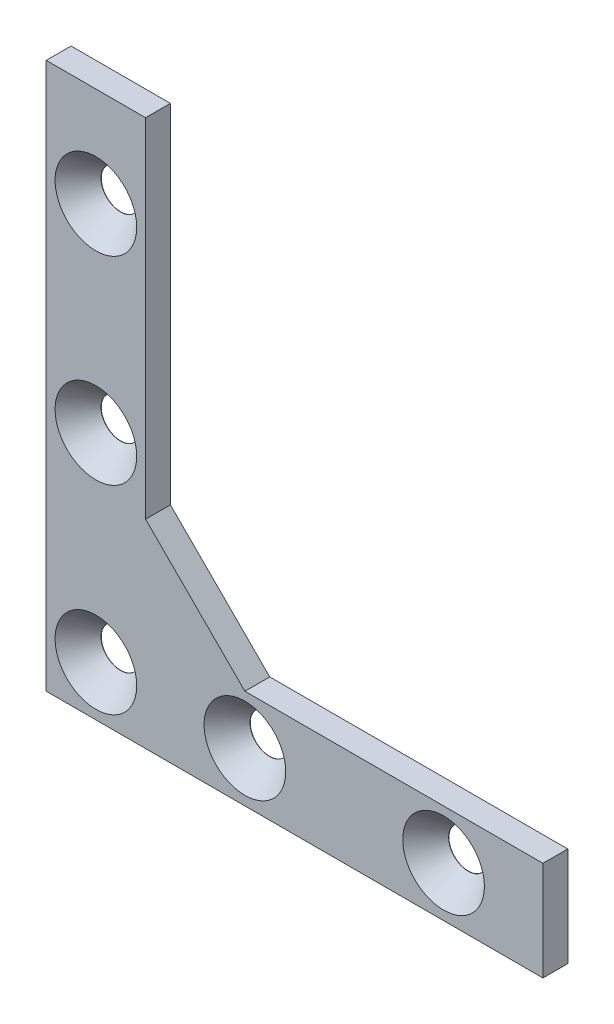
ISO-10303-21;
HEADER;
FILE_DESCRIPTION(('STEP AP214'),'2;1');
FILE_NAME('part.step','',(''),(''),'','','');
FILE_SCHEMA(('AUTOMOTIVE_DESIGN { 1 0 10303 214 1 1 1 1 }'));
ENDSEC;
DATA;
#1=APPLICATION_CONTEXT('core data for automotive mechanical design processes');
#2=APPLICATION_PROTOCOL_DEFINITION('international standard','automotive_design',2000,#1);
#3=PRODUCT_CONTEXT('',#1,'mechanical');
#4=PRODUCT('Part','Part','',(#3));
#5=PRODUCT_RELATED_PRODUCT_CATEGORY('part','',(#4));
#6=PRODUCT_DEFINITION_FORMATION('','',#4);
#7=PRODUCT_DEFINITION_CONTEXT('part definition',#1,'design');
#8=PRODUCT_DEFINITION('design','',#6,#7);
#9=PRODUCT_DEFINITION_SHAPE('','',#8);
#10=(LENGTH_UNIT() NAMED_UNIT(*) SI_UNIT(.MILLI.,.METRE.));
#11=(NAMED_UNIT(*) PLANE_ANGLE_UNIT() SI_UNIT($,.RADIAN.));
#12=(NAMED_UNIT(*) SI_UNIT($,.STERADIAN.) SOLID_ANGLE_UNIT());
#13=UNCERTAINTY_MEASURE_WITH_UNIT(LENGTH_MEASURE(1.E-05),#10,'distance_accuracy_value','');
#14=(GEOMETRIC_REPRESENTATION_CONTEXT(3) GLOBAL_UNCERTAINTY_ASSIGNED_CONTEXT((#13)) GLOBAL_UNIT_ASSIGNED_CONTEXT((#10,
#11,#12)) REPRESENTATION_CONTEXT('',''));
#15=CARTESIAN_POINT('',(0.,0.,0.));
#16=DIRECTION('',(0.,0.,1.));
#17=DIRECTION('',(1.,0.,0.));
#18=AXIS2_PLACEMENT_3D('',#15,#16,#17);
#19=CARTESIAN_POINT('',(-273.453367516007,-6.34999999999997,3.175));
#20=DIRECTION('',(0.,1.,0.));
#21=DIRECTION('',(0.,0.,1.));
#22=AXIS2_PLACEMENT_3D('',#19,#20,#21);
#23=PLANE('',#22);
#24=DIRECTION('',(1.,0.,0.));
#25=VECTOR('',#24,1.);
#26=CARTESIAN_POINT('',(-273.453367516007,-6.34999999999997,0.));
#27=LINE('',#26,#25);
#28=CARTESIAN_POINT('',(-273.453367516007,-6.34999999999997,0.));
#29=VERTEX_POINT('',#28);
#30=CARTESIAN_POINT('',(-209.953367516007,-6.34999999999997,0.));
#31=VERTEX_POINT('',#30);
#32=EDGE_CURVE('E127',#29,#31,#27,.T.);
#33=ORIENTED_EDGE('',*,*,#32,.T.);
#34=DIRECTION('',(0.,0.,-1.));
#35=VECTOR('',#34,1.);
#36=CARTESIAN_POINT('',(-209.953367516007,-6.34999999999997,3.175));
#37=LINE('',#36,#35);
#38=CARTESIAN_POINT('',(-209.953367516007,-6.34999999999997,3.175));
#39=VERTEX_POINT('',#38);
#40=EDGE_CURVE('E11',#39,#31,#37,.T.);
#41=ORIENTED_EDGE('',*,*,#40,.F.);
#42=DIRECTION('',(1.,0.,0.));
#43=VECTOR('',#42,1.);
#44=CARTESIAN_POINT('',(-273.453367516007,-6.34999999999997,3.175));
#45=LINE('',#44,#43);
#46=CARTESIAN_POINT('',(-273.453367516007,-6.34999999999997,3.175));
#47=VERTEX_POINT('',#46);
#48=EDGE_CURVE('E140',#47,#39,#45,.T.);
#49=ORIENTED_EDGE('',*,*,#48,.F.);
#50=DIRECTION('',(0.,0.,-1.));
#51=VECTOR('',#50,1.);
#52=CARTESIAN_POINT('',(-273.453367516007,-6.34999999999997,3.175));
#53=LINE('',#52,#51);
#54=EDGE_CURVE('E123',#47,#29,#53,.T.);
#55=ORIENTED_EDGE('',*,*,#54,.T.);
#56=EDGE_LOOP('',(#33,#41,#49,#55));
#57=FACE_BOUND('',#56,.T.);
#58=ADVANCED_FACE('F37',(#57),#23,.F.);
#59=CARTESIAN_POINT('',(-209.953367516007,-6.34999999999997,3.175));
#60=DIRECTION('',(-1.,0.,0.));
#61=DIRECTION('',(0.,0.,1.));
#62=AXIS2_PLACEMENT_3D('',#59,#60,#61);
#63=PLANE('',#62);
#64=DIRECTION('',(0.,1.,0.));
#65=VECTOR('',#64,1.);
#66=CARTESIAN_POINT('',(-209.953367516007,-6.34999999999997,0.));
#67=LINE('',#66,#65);
#68=CARTESIAN_POINT('',(-209.953367516007,6.3500000000002,0.));
#69=VERTEX_POINT('',#68);
#70=EDGE_CURVE('E130',#31,#69,#67,.T.);
#71=ORIENTED_EDGE('',*,*,#70,.T.);
#72=DIRECTION('',(0.,0.,-1.));
#73=VECTOR('',#72,1.);
#74=CARTESIAN_POINT('',(-209.953367516007,6.3500000000002,3.175));
#75=LINE('',#74,#73);
#76=CARTESIAN_POINT('',(-209.953367516007,6.3500000000002,3.175));
#77=VERTEX_POINT('',#76);
#78=EDGE_CURVE('E45',#77,#69,#75,.T.);
#79=ORIENTED_EDGE('',*,*,#78,.F.);
#80=DIRECTION('',(0.,1.,0.));
#81=VECTOR('',#80,1.);
#82=CARTESIAN_POINT('',(-209.953367516007,-6.34999999999997,3.175));
#83=LINE('',#82,#81);
#84=EDGE_CURVE('E93',#39,#77,#83,.T.);
#85=ORIENTED_EDGE('',*,*,#84,.F.);
#86=ORIENTED_EDGE('',*,*,#40,.T.);
#87=EDGE_LOOP('',(#71,#79,#85,#86));
#88=FACE_BOUND('',#87,.T.);
#89=ADVANCED_FACE('F239',(#88),#63,.F.);
#90=CARTESIAN_POINT('',(-209.953367516007,6.3500000000002,3.175));
#91=DIRECTION('',(0.,-1.,0.));
#92=DIRECTION('',(1.,0.,0.));
#93=AXIS2_PLACEMENT_3D('',#90,#91,#92);
#94=PLANE('',#93);
#95=DIRECTION('',(-1.,0.,0.));
#96=VECTOR('',#95,1.);
#97=CARTESIAN_POINT('',(-209.953367516007,6.3500000000002,0.));
#98=LINE('',#97,#96);
#99=CARTESIAN_POINT('',(-248.053367516008,6.35000000000003,0.));
#100=VERTEX_POINT('',#99);
#101=EDGE_CURVE('E133',#69,#100,#98,.T.);
#102=ORIENTED_EDGE('',*,*,#101,.T.);
#103=DIRECTION('',(0.,0.,-1.));
#104=VECTOR('',#103,1.);
#105=CARTESIAN_POINT('',(-248.053367516008,6.35000000000003,3.175));
#106=LINE('',#105,#104);
#107=CARTESIAN_POINT('',(-248.053367516008,6.35000000000003,3.175));
#108=VERTEX_POINT('',#107);
#109=EDGE_CURVE('E144',#108,#100,#106,.T.);
#110=ORIENTED_EDGE('',*,*,#109,.F.);
#111=DIRECTION('',(-1.,0.,0.));
#112=VECTOR('',#111,1.);
#113=CARTESIAN_POINT('',(-209.953367516007,6.3500000000002,3.175));
#114=LINE('',#113,#112);
#115=EDGE_CURVE('E152',#77,#108,#114,.T.);
#116=ORIENTED_EDGE('',*,*,#115,.F.);
#117=ORIENTED_EDGE('',*,*,#78,.T.);
#118=EDGE_LOOP('',(#102,#110,#116,#117));
#119=FACE_BOUND('',#118,.T.);
#120=ADVANCED_FACE('F150',(#119),#94,.F.);
#121=CARTESIAN_POINT('',(-248.053367516008,6.35000000000003,3.175));
#122=DIRECTION('',(-0.707106781186556,-0.707106781186539,0.));
#123=DIRECTION('',(0.707106781186539,-0.707106781186556,0.));
#124=AXIS2_PLACEMENT_3D('',#121,#122,#123);
#125=PLANE('',#124);
#126=DIRECTION('',(-0.707106781186539,0.707106781186556,0.));
#127=VECTOR('',#126,1.);
#128=CARTESIAN_POINT('',(-248.053367516008,6.35000000000003,0.));
#129=LINE('',#128,#127);
#130=CARTESIAN_POINT('',(-260.753367516007,19.05,0.));
#131=VERTEX_POINT('',#130);
#132=EDGE_CURVE('E135',#100,#131,#129,.T.);
#133=ORIENTED_EDGE('',*,*,#132,.T.);
#134=DIRECTION('',(0.,0.,-1.));
#135=VECTOR('',#134,1.);
#136=CARTESIAN_POINT('',(-260.753367516007,19.05,3.175));
#137=LINE('',#136,#135);
#138=CARTESIAN_POINT('',(-260.753367516007,19.05,3.175));
#139=VERTEX_POINT('',#138);
#140=EDGE_CURVE('E118',#139,#131,#137,.T.);
#141=ORIENTED_EDGE('',*,*,#140,.F.);
#142=DIRECTION('',(-0.707106781186539,0.707106781186556,0.));
#143=VECTOR('',#142,1.);
#144=CARTESIAN_POINT('',(-248.053367516008,6.35000000000003,3.175));
#145=LINE('',#144,#143);
#146=EDGE_CURVE('E109',#108,#139,#145,.T.);
#147=ORIENTED_EDGE('',*,*,#146,.F.);
#148=ORIENTED_EDGE('',*,*,#109,.T.);
#149=EDGE_LOOP('',(#133,#141,#147,#148));
#150=FACE_BOUND('',#149,.T.);
#151=ADVANCED_FACE('F158',(#150),#125,.F.);
#152=CARTESIAN_POINT('',(-260.753367516007,19.05,3.175));
#153=DIRECTION('',(-1.,0.,0.));
#154=DIRECTION('',(0.,0.,1.));
#155=AXIS2_PLACEMENT_3D('',#152,#153,#154);
#156=PLANE('',#155);
#157=DIRECTION('',(0.,1.,0.));
#158=VECTOR('',#157,1.);
#159=CARTESIAN_POINT('',(-260.753367516007,19.05,0.));
#160=LINE('',#159,#158);
#161=CARTESIAN_POINT('',(-260.753367516007,63.5,0.));
#162=VERTEX_POINT('',#161);
#163=EDGE_CURVE('E117',#131,#162,#160,.T.);
#164=ORIENTED_EDGE('',*,*,#163,.T.);
#165=DIRECTION('',(0.,0.,-1.));
#166=VECTOR('',#165,1.);
#167=CARTESIAN_POINT('',(-260.753367516007,63.5,3.175));
#168=LINE('',#167,#166);
#169=CARTESIAN_POINT('',(-260.753367516007,63.5,3.175));
#170=VERTEX_POINT('',#169);
#171=EDGE_CURVE('E114',#170,#162,#168,.T.);
#172=ORIENTED_EDGE('',*,*,#171,.F.);
#173=DIRECTION('',(0.,1.,0.));
#174=VECTOR('',#173,1.);
#175=CARTESIAN_POINT('',(-260.753367516007,19.05,3.175));
#176=LINE('',#175,#174);
#177=EDGE_CURVE('E103',#139,#170,#176,.T.);
#178=ORIENTED_EDGE('',*,*,#177,.F.);
#179=ORIENTED_EDGE('',*,*,#140,.T.);
#180=EDGE_LOOP('',(#164,#172,#178,#179));
#181=FACE_BOUND('',#180,.T.);
#182=ADVANCED_FACE('F115',(#181),#156,.F.);
#183=CARTESIAN_POINT('',(-273.453367516007,63.5,3.175));
#184=DIRECTION('',(0.,-1.,0.));
#185=DIRECTION('',(0.,0.,-1.));
#186=AXIS2_PLACEMENT_3D('',#183,#184,#185);
#187=PLANE('',#186);
#188=DIRECTION('',(-1.,0.,0.));
#189=VECTOR('',#188,1.);
#190=CARTESIAN_POINT('',(-273.453367516007,63.5,0.));
#191=LINE('',#190,#189);
#192=CARTESIAN_POINT('',(-273.453367516007,63.5,0.));
#193=VERTEX_POINT('',#192);
#194=EDGE_CURVE('E79',#162,#193,#191,.T.);
#195=ORIENTED_EDGE('',*,*,#194,.T.);
#196=DIRECTION('',(0.,0.,-1.));
#197=VECTOR('',#196,1.);
#198=CARTESIAN_POINT('',(-273.453367516007,63.5,3.175));
#199=LINE('',#198,#197);
#200=CARTESIAN_POINT('',(-273.453367516007,63.5,3.175));
#201=VERTEX_POINT('',#200);
#202=EDGE_CURVE('E119',#201,#193,#199,.T.);
#203=ORIENTED_EDGE('',*,*,#202,.F.);
#204=DIRECTION('',(-1.,0.,0.));
#205=VECTOR('',#204,1.);
#206=CARTESIAN_POINT('',(-273.453367516007,63.5,3.175));
#207=LINE('',#206,#205);
#208=EDGE_CURVE('E107',#170,#201,#207,.T.);
#209=ORIENTED_EDGE('',*,*,#208,.F.);
#210=ORIENTED_EDGE('',*,*,#171,.T.);
#211=EDGE_LOOP('',(#195,#203,#209,#210));
#212=FACE_BOUND('',#211,.T.);
#213=ADVANCED_FACE('F121',(#212),#187,.F.);
#214=CARTESIAN_POINT('',(-273.453367516007,-6.34999999999997,3.175));
#215=DIRECTION('',(1.,0.,0.));
#216=DIRECTION('',(0.,0.,-1.));
#217=AXIS2_PLACEMENT_3D('',#214,#215,#216);
#218=PLANE('',#217);
#219=DIRECTION('',(0.,-1.,0.));
#220=VECTOR('',#219,1.);
#221=CARTESIAN_POINT('',(-273.453367516007,-6.34999999999997,0.));
#222=LINE('',#221,#220);
#223=EDGE_CURVE('E85',#193,#29,#222,.T.);
#224=ORIENTED_EDGE('',*,*,#223,.T.);
#225=ORIENTED_EDGE('',*,*,#54,.F.);
#226=DIRECTION('',(0.,-1.,0.));
#227=VECTOR('',#226,1.);
#228=CARTESIAN_POINT('',(-273.453367516007,-6.34999999999997,3.175));
#229=LINE('',#228,#227);
#230=EDGE_CURVE('E53',#201,#47,#229,.T.);
#231=ORIENTED_EDGE('',*,*,#230,.F.);
#232=ORIENTED_EDGE('',*,*,#202,.T.);
#233=EDGE_LOOP('',(#224,#225,#231,#232));
#234=FACE_BOUND('',#233,.T.);
#235=ADVANCED_FACE('F212',(#234),#218,.F.);
#236=CARTESIAN_POINT('',(0.,0.,3.175));
#237=DIRECTION('',(0.,0.,1.));
#238=DIRECTION('',(1.,0.,0.));
#239=AXIS2_PLACEMENT_3D('',#236,#237,#238);
#240=PLANE('',#239);
#241=CARTESIAN_POINT('',(-267.103367516007,0.038229414694689,3.175));
#242=DIRECTION('',(0.,0.,1.));
#243=DIRECTION('',(1.,0.,0.));
#244=AXIS2_PLACEMENT_3D('',#241,#242,#243);
#245=CIRCLE('',#244,5.21969999999999);
#246=CARTESIAN_POINT('',(-261.883667516008,0.038229414694689,3.175));
#247=VERTEX_POINT('',#246);
#248=EDGE_CURVE('E204',#247,#247,#245,.T.);
#249=ORIENTED_EDGE('',*,*,#248,.F.);
#250=EDGE_LOOP('',(#249));
#251=FACE_BOUND('',#250,.T.);
#252=CARTESIAN_POINT('',(-267.103367516007,25.4382294146947,3.175));
#253=DIRECTION('',(0.,0.,1.));
#254=DIRECTION('',(1.,0.,0.));
#255=AXIS2_PLACEMENT_3D('',#252,#253,#254);
#256=CIRCLE('',#255,5.21969999999999);
#257=CARTESIAN_POINT('',(-261.883667516008,25.4382294146947,3.175));
#258=VERTEX_POINT('',#257);
#259=EDGE_CURVE('E195',#258,#258,#256,.T.);
#260=ORIENTED_EDGE('',*,*,#259,.F.);
#261=EDGE_LOOP('',(#260));
#262=FACE_BOUND('',#261,.T.);
#263=CARTESIAN_POINT('',(-267.103367516007,50.8,3.175));
#264=DIRECTION('',(0.,0.,1.));
#265=DIRECTION('',(1.,0.,0.));
#266=AXIS2_PLACEMENT_3D('',#263,#264,#265);
#267=CIRCLE('',#266,5.21969999999999);
#268=CARTESIAN_POINT('',(-261.883667516008,50.8,3.175));
#269=VERTEX_POINT('',#268);
#270=EDGE_CURVE('E186',#269,#269,#267,.T.);
#271=ORIENTED_EDGE('',*,*,#270,.F.);
#272=EDGE_LOOP('',(#271));
#273=FACE_BOUND('',#272,.T.);
#274=CARTESIAN_POINT('',(-248.053367516007,0.038229414694689,3.175));
#275=DIRECTION('',(0.,0.,1.));
#276=DIRECTION('',(1.,0.,0.));
#277=AXIS2_PLACEMENT_3D('',#274,#275,#276);
#278=CIRCLE('',#277,5.21969999999999);
#279=CARTESIAN_POINT('',(-242.833667516007,0.038229414694689,3.175));
#280=VERTEX_POINT('',#279);
#281=EDGE_CURVE('E177',#280,#280,#278,.T.);
#282=ORIENTED_EDGE('',*,*,#281,.F.);
#283=EDGE_LOOP('',(#282));
#284=FACE_BOUND('',#283,.T.);
#285=CARTESIAN_POINT('',(-222.653367516007,0.038229414694689,3.175));
#286=DIRECTION('',(0.,0.,1.));
#287=DIRECTION('',(1.,0.,0.));
#288=AXIS2_PLACEMENT_3D('',#285,#286,#287);
#289=CIRCLE('',#288,5.21969999999999);
#290=CARTESIAN_POINT('',(-217.433667516007,0.038229414694689,3.175));
#291=VERTEX_POINT('',#290);
#292=EDGE_CURVE('E168',#291,#291,#289,.T.);
#293=ORIENTED_EDGE('',*,*,#292,.F.);
#294=EDGE_LOOP('',(#293));
#295=FACE_BOUND('',#294,.T.);
#296=ORIENTED_EDGE('',*,*,#48,.T.);
#297=ORIENTED_EDGE('',*,*,#84,.T.);
#298=ORIENTED_EDGE('',*,*,#115,.T.);
#299=ORIENTED_EDGE('',*,*,#146,.T.);
#300=ORIENTED_EDGE('',*,*,#177,.T.);
#301=ORIENTED_EDGE('',*,*,#208,.T.);
#302=ORIENTED_EDGE('',*,*,#230,.T.);
#303=EDGE_LOOP('',(#296,#297,#298,#299,#300,#301,#302));
#304=FACE_BOUND('',#303,.T.);
#305=ADVANCED_FACE('F105',(#251,#262,#273,#284,#295,#304),#240,.T.);
#306=CARTESIAN_POINT('',(0.,0.,0.));
#307=DIRECTION('',(0.,0.,1.));
#308=DIRECTION('',(1.,0.,0.));
#309=AXIS2_PLACEMENT_3D('',#306,#307,#308);
#310=PLANE('',#309);
#311=CARTESIAN_POINT('',(-267.103367516007,0.038229414694689,0.));
#312=DIRECTION('',(0.,0.,1.));
#313=DIRECTION('',(1.,0.,0.));
#314=AXIS2_PLACEMENT_3D('',#311,#312,#313);
#315=CIRCLE('',#314,2.48920000000002);
#316=CARTESIAN_POINT('',(-264.614167516007,0.038229414694689,0.));
#317=VERTEX_POINT('',#316);
#318=EDGE_CURVE('E198',#317,#317,#315,.T.);
#319=ORIENTED_EDGE('',*,*,#318,.T.);
#320=EDGE_LOOP('',(#319));
#321=FACE_BOUND('',#320,.T.);
#322=CARTESIAN_POINT('',(-267.103367516007,25.4382294146947,0.));
#323=DIRECTION('',(0.,0.,1.));
#324=DIRECTION('',(1.,0.,0.));
#325=AXIS2_PLACEMENT_3D('',#322,#323,#324);
#326=CIRCLE('',#325,2.48920000000002);
#327=CARTESIAN_POINT('',(-264.614167516007,25.4382294146947,0.));
#328=VERTEX_POINT('',#327);
#329=EDGE_CURVE('E189',#328,#328,#326,.T.);
#330=ORIENTED_EDGE('',*,*,#329,.T.);
#331=EDGE_LOOP('',(#330));
#332=FACE_BOUND('',#331,.T.);
#333=CARTESIAN_POINT('',(-267.103367516007,50.8,0.));
#334=DIRECTION('',(0.,0.,1.));
#335=DIRECTION('',(1.,0.,0.));
#336=AXIS2_PLACEMENT_3D('',#333,#334,#335);
#337=CIRCLE('',#336,2.48920000000002);
#338=CARTESIAN_POINT('',(-264.614167516007,50.8,0.));
#339=VERTEX_POINT('',#338);
#340=EDGE_CURVE('E180',#339,#339,#337,.T.);
#341=ORIENTED_EDGE('',*,*,#340,.T.);
#342=EDGE_LOOP('',(#341));
#343=FACE_BOUND('',#342,.T.);
#344=CARTESIAN_POINT('',(-248.053367516007,0.038229414694689,0.));
#345=DIRECTION('',(0.,0.,1.));
#346=DIRECTION('',(1.,0.,0.));
#347=AXIS2_PLACEMENT_3D('',#344,#345,#346);
#348=CIRCLE('',#347,2.4892);
#349=CARTESIAN_POINT('',(-245.564167516007,0.038229414694689,0.));
#350=VERTEX_POINT('',#349);
#351=EDGE_CURVE('E171',#350,#350,#348,.T.);
#352=ORIENTED_EDGE('',*,*,#351,.T.);
#353=EDGE_LOOP('',(#352));
#354=FACE_BOUND('',#353,.T.);
#355=CARTESIAN_POINT('',(-222.653367516007,0.038229414694689,0.));
#356=DIRECTION('',(0.,0.,1.));
#357=DIRECTION('',(1.,0.,0.));
#358=AXIS2_PLACEMENT_3D('',#355,#356,#357);
#359=CIRCLE('',#358,2.4892);
#360=CARTESIAN_POINT('',(-220.164167516007,0.038229414694689,0.));
#361=VERTEX_POINT('',#360);
#362=EDGE_CURVE('E131',#361,#361,#359,.T.);
#363=ORIENTED_EDGE('',*,*,#362,.T.);
#364=EDGE_LOOP('',(#363));
#365=FACE_BOUND('',#364,.T.);
#366=ORIENTED_EDGE('',*,*,#32,.F.);
#367=ORIENTED_EDGE('',*,*,#223,.F.);
#368=ORIENTED_EDGE('',*,*,#194,.F.);
#369=ORIENTED_EDGE('',*,*,#163,.F.);
#370=ORIENTED_EDGE('',*,*,#132,.F.);
#371=ORIENTED_EDGE('',*,*,#101,.F.);
#372=ORIENTED_EDGE('',*,*,#70,.F.);
#373=EDGE_LOOP('',(#366,#367,#368,#369,#370,#371,#372));
#374=FACE_BOUND('',#373,.T.);
#375=ADVANCED_FACE('F156',(#321,#332,#343,#354,#365,#374),#310,.F.);
#376=CARTESIAN_POINT('',(-222.653367516007,0.038229414694689,3.175));
#377=DIRECTION('',(0.,0.,1.));
#378=DIRECTION('',(1.,0.,0.));
#379=AXIS2_PLACEMENT_3D('',#376,#377,#378);
#380=CYLINDRICAL_SURFACE('',#379,2.4892);
#381=ORIENTED_EDGE('',*,*,#362,.F.);
#382=EDGE_LOOP('',(#381));
#383=FACE_BOUND('',#382,.T.);
#384=CARTESIAN_POINT('',(-222.653367516007,0.038229414694689,0.0339190640830126));
#385=DIRECTION('',(0.,0.,1.));
#386=DIRECTION('',(1.,0.,0.));
#387=AXIS2_PLACEMENT_3D('',#384,#385,#386);
#388=CIRCLE('',#387,2.4892);
#389=CARTESIAN_POINT('',(-220.164167516007,0.038229414694689,0.0339190640830126));
#390=VERTEX_POINT('',#389);
#391=EDGE_CURVE('E165',#390,#390,#388,.T.);
#392=ORIENTED_EDGE('',*,*,#391,.T.);
#393=EDGE_LOOP('',(#392));
#394=FACE_BOUND('',#393,.T.);
#395=ADVANCED_FACE('F225',(#383,#394),#380,.F.);
#396=CARTESIAN_POINT('',(-222.653367516007,0.038229414694689,3.175));
#397=DIRECTION('',(0.,0.,1.));
#398=DIRECTION('',(1.,0.,0.));
#399=AXIS2_PLACEMENT_3D('',#396,#397,#398);
#400=CONICAL_SURFACE('',#399,5.21969999999999,0.715584993317671);
#401=ORIENTED_EDGE('',*,*,#391,.F.);
#402=EDGE_LOOP('',(#401));
#403=FACE_BOUND('',#402,.T.);
#404=ORIENTED_EDGE('',*,*,#292,.T.);
#405=EDGE_LOOP('',(#404));
#406=FACE_BOUND('',#405,.T.);
#407=ADVANCED_FACE('F222',(#403,#406),#400,.F.);
#408=CARTESIAN_POINT('',(-248.053367516007,0.038229414694689,3.175));
#409=DIRECTION('',(0.,0.,1.));
#410=DIRECTION('',(1.,0.,0.));
#411=AXIS2_PLACEMENT_3D('',#408,#409,#410);
#412=CYLINDRICAL_SURFACE('',#411,2.4892);
#413=ORIENTED_EDGE('',*,*,#351,.F.);
#414=EDGE_LOOP('',(#413));
#415=FACE_BOUND('',#414,.T.);
#416=CARTESIAN_POINT('',(-248.053367516007,0.038229414694689,0.0339190640830126));
#417=DIRECTION('',(0.,0.,1.));
#418=DIRECTION('',(1.,0.,0.));
#419=AXIS2_PLACEMENT_3D('',#416,#417,#418);
#420=CIRCLE('',#419,2.4892);
#421=CARTESIAN_POINT('',(-245.564167516007,0.038229414694689,0.0339190640830126));
#422=VERTEX_POINT('',#421);
#423=EDGE_CURVE('E174',#422,#422,#420,.T.);
#424=ORIENTED_EDGE('',*,*,#423,.T.);
#425=EDGE_LOOP('',(#424));
#426=FACE_BOUND('',#425,.T.);
#427=ADVANCED_FACE('F224',(#415,#426),#412,.F.);
#428=CARTESIAN_POINT('',(-248.053367516007,0.038229414694689,3.175));
#429=DIRECTION('',(0.,0.,1.));
#430=DIRECTION('',(1.,0.,0.));
#431=AXIS2_PLACEMENT_3D('',#428,#429,#430);
#432=CONICAL_SURFACE('',#431,5.21969999999999,0.715584993317671);
#433=ORIENTED_EDGE('',*,*,#423,.F.);
#434=EDGE_LOOP('',(#433));
#435=FACE_BOUND('',#434,.T.);
#436=ORIENTED_EDGE('',*,*,#281,.T.);
#437=EDGE_LOOP('',(#436));
#438=FACE_BOUND('',#437,.T.);
#439=ADVANCED_FACE('F232',(#435,#438),#432,.F.);
#440=CARTESIAN_POINT('',(-267.103367516007,50.8,3.175));
#441=DIRECTION('',(0.,0.,1.));
#442=DIRECTION('',(1.,0.,0.));
#443=AXIS2_PLACEMENT_3D('',#440,#441,#442);
#444=CYLINDRICAL_SURFACE('',#443,2.4892);
#445=ORIENTED_EDGE('',*,*,#340,.F.);
#446=EDGE_LOOP('',(#445));
#447=FACE_BOUND('',#446,.T.);
#448=CARTESIAN_POINT('',(-267.103367516007,50.8,0.0339190640830126));
#449=DIRECTION('',(0.,0.,1.));
#450=DIRECTION('',(1.,0.,0.));
#451=AXIS2_PLACEMENT_3D('',#448,#449,#450);
#452=CIRCLE('',#451,2.48919999999997);
#453=CARTESIAN_POINT('',(-264.614167516008,50.8,0.0339190640830126));
#454=VERTEX_POINT('',#453);
#455=EDGE_CURVE('E183',#454,#454,#452,.T.);
#456=ORIENTED_EDGE('',*,*,#455,.T.);
#457=EDGE_LOOP('',(#456));
#458=FACE_BOUND('',#457,.T.);
#459=ADVANCED_FACE('F325',(#447,#458),#444,.F.);
#460=CARTESIAN_POINT('',(-267.103367516007,50.8,3.175));
#461=DIRECTION('',(0.,0.,1.));
#462=DIRECTION('',(1.,0.,0.));
#463=AXIS2_PLACEMENT_3D('',#460,#461,#462);
#464=CONICAL_SURFACE('',#463,5.21969999999999,0.715584993317676);
#465=ORIENTED_EDGE('',*,*,#455,.F.);
#466=EDGE_LOOP('',(#465));
#467=FACE_BOUND('',#466,.T.);
#468=ORIENTED_EDGE('',*,*,#270,.T.);
#469=EDGE_LOOP('',(#468));
#470=FACE_BOUND('',#469,.T.);
#471=ADVANCED_FACE('F336',(#467,#470),#464,.F.);
#472=CARTESIAN_POINT('',(-267.103367516007,25.4382294146947,3.175));
#473=DIRECTION('',(0.,0.,1.));
#474=DIRECTION('',(1.,0.,0.));
#475=AXIS2_PLACEMENT_3D('',#472,#473,#474);
#476=CYLINDRICAL_SURFACE('',#475,2.4892);
#477=ORIENTED_EDGE('',*,*,#329,.F.);
#478=EDGE_LOOP('',(#477));
#479=FACE_BOUND('',#478,.T.);
#480=CARTESIAN_POINT('',(-267.103367516007,25.4382294146947,0.0339190640830126));
#481=DIRECTION('',(0.,0.,1.));
#482=DIRECTION('',(1.,0.,0.));
#483=AXIS2_PLACEMENT_3D('',#480,#481,#482);
#484=CIRCLE('',#483,2.48919999999997);
#485=CARTESIAN_POINT('',(-264.614167516008,25.4382294146947,0.0339190640830126));
#486=VERTEX_POINT('',#485);
#487=EDGE_CURVE('E192',#486,#486,#484,.T.);
#488=ORIENTED_EDGE('',*,*,#487,.T.);
#489=EDGE_LOOP('',(#488));
#490=FACE_BOUND('',#489,.T.);
#491=ADVANCED_FACE('F347',(#479,#490),#476,.F.);
#492=CARTESIAN_POINT('',(-267.103367516007,25.4382294146947,3.175));
#493=DIRECTION('',(0.,0.,1.));
#494=DIRECTION('',(1.,0.,0.));
#495=AXIS2_PLACEMENT_3D('',#492,#493,#494);
#496=CONICAL_SURFACE('',#495,5.21969999999999,0.715584993317676);
#497=ORIENTED_EDGE('',*,*,#487,.F.);
#498=EDGE_LOOP('',(#497));
#499=FACE_BOUND('',#498,.T.);
#500=ORIENTED_EDGE('',*,*,#259,.T.);
#501=EDGE_LOOP('',(#500));
#502=FACE_BOUND('',#501,.T.);
#503=ADVANCED_FACE('F358',(#499,#502),#496,.F.);
#504=CARTESIAN_POINT('',(-267.103367516007,0.038229414694689,3.175));
#505=DIRECTION('',(0.,0.,1.));
#506=DIRECTION('',(1.,0.,0.));
#507=AXIS2_PLACEMENT_3D('',#504,#505,#506);
#508=CYLINDRICAL_SURFACE('',#507,2.4892);
#509=ORIENTED_EDGE('',*,*,#318,.F.);
#510=EDGE_LOOP('',(#509));
#511=FACE_BOUND('',#510,.T.);
#512=CARTESIAN_POINT('',(-267.103367516007,0.038229414694689,0.0339190640830126));
#513=DIRECTION('',(0.,0.,1.));
#514=DIRECTION('',(1.,0.,0.));
#515=AXIS2_PLACEMENT_3D('',#512,#513,#514);
#516=CIRCLE('',#515,2.48919999999997);
#517=CARTESIAN_POINT('',(-264.614167516008,0.038229414694689,0.0339190640830126));
#518=VERTEX_POINT('',#517);
#519=EDGE_CURVE('E201',#518,#518,#516,.T.);
#520=ORIENTED_EDGE('',*,*,#519,.T.);
#521=EDGE_LOOP('',(#520));
#522=FACE_BOUND('',#521,.T.);
#523=ADVANCED_FACE('F369',(#511,#522),#508,.F.);
#524=CARTESIAN_POINT('',(-267.103367516007,0.038229414694689,3.175));
#525=DIRECTION('',(0.,0.,1.));
#526=DIRECTION('',(1.,0.,0.));
#527=AXIS2_PLACEMENT_3D('',#524,#525,#526);
#528=CONICAL_SURFACE('',#527,5.21969999999999,0.715584993317676);
#529=ORIENTED_EDGE('',*,*,#519,.F.);
#530=EDGE_LOOP('',(#529));
#531=FACE_BOUND('',#530,.T.);
#532=ORIENTED_EDGE('',*,*,#248,.T.);
#533=EDGE_LOOP('',(#532));
#534=FACE_BOUND('',#533,.T.);
#535=ADVANCED_FACE('F208',(#531,#534),#528,.F.);
#536=CLOSED_SHELL('',(#58,#89,#120,#151,#182,#213,#235,#305,#375,#395,#407,#427,#439,#459,#471,
#491,#503,#523,#535));
#537=MANIFOLD_SOLID_BREP('B2',#536);
#538=ADVANCED_BREP_SHAPE_REPRESENTATION('',(#18,#537),#14);
#539=SHAPE_DEFINITION_REPRESENTATION(#9,#538);
ENDSEC;
END-ISO-10303-21;
